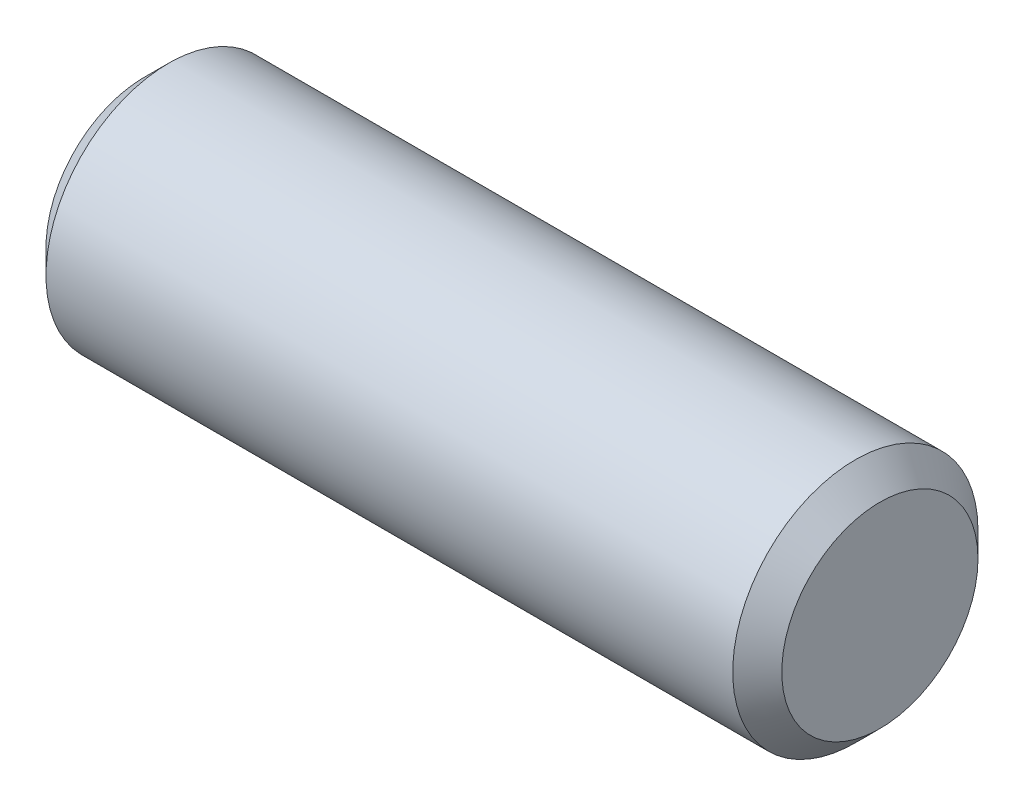
ISO-10303-21;
HEADER;
FILE_DESCRIPTION(('STEP AP214'),'2;1');
FILE_NAME('part.step','',(''),(''),'','','');
FILE_SCHEMA(('AUTOMOTIVE_DESIGN { 1 0 10303 214 1 1 1 1 }'));
ENDSEC;
DATA;
#1=APPLICATION_CONTEXT('core data for automotive mechanical design processes');
#2=APPLICATION_PROTOCOL_DEFINITION('international standard','automotive_design',2000,#1);
#3=PRODUCT_CONTEXT('',#1,'mechanical');
#4=PRODUCT('Part','Part','',(#3));
#5=PRODUCT_RELATED_PRODUCT_CATEGORY('part','',(#4));
#6=PRODUCT_DEFINITION_FORMATION('','',#4);
#7=PRODUCT_DEFINITION_CONTEXT('part definition',#1,'design');
#8=PRODUCT_DEFINITION('design','',#6,#7);
#9=PRODUCT_DEFINITION_SHAPE('','',#8);
#10=(LENGTH_UNIT() NAMED_UNIT(*) SI_UNIT(.MILLI.,.METRE.));
#11=(NAMED_UNIT(*) PLANE_ANGLE_UNIT() SI_UNIT($,.RADIAN.));
#12=(NAMED_UNIT(*) SI_UNIT($,.STERADIAN.) SOLID_ANGLE_UNIT());
#13=UNCERTAINTY_MEASURE_WITH_UNIT(LENGTH_MEASURE(1.E-05),#10,'distance_accuracy_value','');
#14=(GEOMETRIC_REPRESENTATION_CONTEXT(3) GLOBAL_UNCERTAINTY_ASSIGNED_CONTEXT((#13)) GLOBAL_UNIT_ASSIGNED_CONTEXT((#10,
#11,#12)) REPRESENTATION_CONTEXT('',''));
#15=CARTESIAN_POINT('',(0.,0.,0.));
#16=DIRECTION('',(0.,0.,1.));
#17=DIRECTION('',(1.,0.,0.));
#18=AXIS2_PLACEMENT_3D('',#15,#16,#17);
#19=CARTESIAN_POINT('',(-4.7625,0.,0.));
#20=DIRECTION('',(1.,0.,0.));
#21=DIRECTION('',(0.,0.,-1.));
#22=AXIS2_PLACEMENT_3D('',#19,#20,#21);
#23=CYLINDRICAL_SURFACE('',#22,1.5875);
#24=CARTESIAN_POINT('',(4.445,0.,0.));
#25=DIRECTION('',(1.,0.,0.));
#26=DIRECTION('',(0.,0.,-1.));
#27=AXIS2_PLACEMENT_3D('',#24,#25,#26);
#28=CIRCLE('',#27,1.5875);
#29=CARTESIAN_POINT('',(4.445,0.,-1.5875));
#30=VERTEX_POINT('',#29);
#31=EDGE_CURVE('E40',#30,#30,#28,.F.);
#32=CARTESIAN_POINT('',(-4.445,0.,0.));
#33=DIRECTION('',(1.,0.,0.));
#34=DIRECTION('',(0.,0.,-1.));
#35=AXIS2_PLACEMENT_3D('',#32,#33,#34);
#36=CIRCLE('',#35,1.5875);
#37=CARTESIAN_POINT('',(-4.445,0.,-1.5875));
#38=VERTEX_POINT('',#37);
#39=EDGE_CURVE('E44',#38,#38,#36,.T.);
#40=CARTESIAN_POINT('',(4.445,0.,-1.5875));
#41=CARTESIAN_POINT('',(4.35239583333334,0.,-1.5875));
#42=CARTESIAN_POINT('',(4.25979166666667,0.,-1.5875));
#43=CARTESIAN_POINT('',(4.07458333333333,0.,-1.5875));
#44=CARTESIAN_POINT('',(3.98197916666667,0.,-1.5875));
#45=CARTESIAN_POINT('',(3.79677083333334,0.,-1.5875));
#46=CARTESIAN_POINT('',(3.70416666666667,0.,-1.5875));
#47=CARTESIAN_POINT('',(3.51895833333334,0.,-1.5875));
#48=CARTESIAN_POINT('',(3.42635416666667,0.,-1.5875));
#49=CARTESIAN_POINT('',(3.24114583333334,0.,-1.5875));
#50=CARTESIAN_POINT('',(3.14854166666667,0.,-1.5875));
#51=CARTESIAN_POINT('',(2.96333333333334,0.,-1.5875));
#52=CARTESIAN_POINT('',(2.87072916666667,0.,-1.5875));
#53=CARTESIAN_POINT('',(2.68552083333334,0.,-1.5875));
#54=CARTESIAN_POINT('',(2.59291666666667,0.,-1.5875));
#55=CARTESIAN_POINT('',(2.40770833333334,0.,-1.5875));
#56=CARTESIAN_POINT('',(2.31510416666667,0.,-1.5875));
#57=CARTESIAN_POINT('',(2.12989583333334,0.,-1.5875));
#58=CARTESIAN_POINT('',(2.03729166666667,0.,-1.5875));
#59=CARTESIAN_POINT('',(1.85208333333334,0.,-1.5875));
#60=CARTESIAN_POINT('',(1.75947916666667,0.,-1.5875));
#61=CARTESIAN_POINT('',(1.57427083333334,0.,-1.5875));
#62=CARTESIAN_POINT('',(1.48166666666667,0.,-1.5875));
#63=CARTESIAN_POINT('',(1.29645833333334,0.,-1.5875));
#64=CARTESIAN_POINT('',(1.20385416666667,0.,-1.5875));
#65=CARTESIAN_POINT('',(1.01864583333334,0.,-1.5875));
#66=CARTESIAN_POINT('',(0.926041666666669,0.,-1.5875));
#67=CARTESIAN_POINT('',(0.740833333333336,0.,-1.5875));
#68=CARTESIAN_POINT('',(0.648229166666669,0.,-1.5875));
#69=CARTESIAN_POINT('',(0.463020833333336,0.,-1.5875));
#70=CARTESIAN_POINT('',(0.370416666666669,0.,-1.5875));
#71=CARTESIAN_POINT('',(0.185208333333336,0.,-1.5875));
#72=CARTESIAN_POINT('',(0.0926041666666694,0.,-1.5875));
#73=CARTESIAN_POINT('',(-0.0926041666666642,0.,-1.5875));
#74=CARTESIAN_POINT('',(-0.185208333333331,0.,-1.5875));
#75=CARTESIAN_POINT('',(-0.370416666666664,0.,-1.5875));
#76=CARTESIAN_POINT('',(-0.463020833333331,0.,-1.5875));
#77=CARTESIAN_POINT('',(-0.648229166666664,0.,-1.5875));
#78=CARTESIAN_POINT('',(-0.740833333333331,0.,-1.5875));
#79=CARTESIAN_POINT('',(-0.926041666666664,0.,-1.5875));
#80=CARTESIAN_POINT('',(-1.01864583333333,0.,-1.5875));
#81=CARTESIAN_POINT('',(-1.20385416666666,0.,-1.5875));
#82=CARTESIAN_POINT('',(-1.29645833333333,0.,-1.5875));
#83=CARTESIAN_POINT('',(-1.48166666666666,0.,-1.5875));
#84=CARTESIAN_POINT('',(-1.57427083333333,0.,-1.5875));
#85=CARTESIAN_POINT('',(-1.75947916666666,0.,-1.5875));
#86=CARTESIAN_POINT('',(-1.85208333333333,0.,-1.5875));
#87=CARTESIAN_POINT('',(-2.03729166666666,0.,-1.5875));
#88=CARTESIAN_POINT('',(-2.12989583333333,0.,-1.5875));
#89=CARTESIAN_POINT('',(-2.31510416666666,0.,-1.5875));
#90=CARTESIAN_POINT('',(-2.40770833333333,0.,-1.5875));
#91=CARTESIAN_POINT('',(-2.59291666666666,0.,-1.5875));
#92=CARTESIAN_POINT('',(-2.68552083333333,0.,-1.5875));
#93=CARTESIAN_POINT('',(-2.87072916666666,0.,-1.5875));
#94=CARTESIAN_POINT('',(-2.96333333333333,0.,-1.5875));
#95=CARTESIAN_POINT('',(-3.14854166666666,0.,-1.5875));
#96=CARTESIAN_POINT('',(-3.24114583333333,0.,-1.5875));
#97=CARTESIAN_POINT('',(-3.42635416666666,0.,-1.5875));
#98=CARTESIAN_POINT('',(-3.51895833333333,0.,-1.5875));
#99=CARTESIAN_POINT('',(-3.70416666666666,0.,-1.5875));
#100=CARTESIAN_POINT('',(-3.79677083333333,0.,-1.5875));
#101=CARTESIAN_POINT('',(-3.98197916666666,0.,-1.5875));
#102=CARTESIAN_POINT('',(-4.07458333333333,0.,-1.5875));
#103=CARTESIAN_POINT('',(-4.25979166666666,0.,-1.5875));
#104=CARTESIAN_POINT('',(-4.35239583333333,0.,-1.5875));
#105=CARTESIAN_POINT('',(-4.445,0.,-1.5875));
#106=B_SPLINE_CURVE_WITH_KNOTS('',3,(#40,#41,#42,#43,#44,#45,#46,#47,#48,#49,#50,#51,#52,#53,
#54,#55,#56,#57,#58,#59,#60,#61,#62,#63,#64,#65,#66,#67,#68,#69,#70,#71,#72,#73,#74,#75,#76,#77,
#78,#79,#80,#81,#82,#83,#84,#85,#86,#87,#88,#89,#90,#91,#92,#93,#94,#95,#96,#97,#98,#99,#100,
#101,#102,#103,#104,#105),.UNSPECIFIED.,.F.,.F.,(4,2,2,2,2,2,2,2,2,2,2,2,2,2,2,2,2,2,2,2,2,2,2,
2,2,2,2,2,2,2,2,2,4),(0.,0.2778125,0.555625000000001,0.833437499999999,1.11125,1.3890625,
1.666875,1.9446875,2.2225,2.5003125,2.778125,3.0559375,3.33375,3.6115625,3.889375,4.1671875,
4.445,4.7228125,5.000625,5.2784375,5.55625,5.8340625,6.111875,6.3896875,6.6675,6.9453125,
7.223125,7.5009375,7.77875,8.0565625,8.334375,8.6121875,8.89),.UNSPECIFIED.);
#107=EDGE_CURVE('BSEAM33',#30,#38,#106,.T.);
#108=ORIENTED_EDGE('',*,*,#31,.T.);
#109=ORIENTED_EDGE('',*,*,#39,.T.);
#110=ORIENTED_EDGE('',*,*,#107,.T.);
#111=ORIENTED_EDGE('',*,*,#107,.F.);
#112=EDGE_LOOP('',(#108,#110,#109,#111));
#113=FACE_BOUND('',#112,.T.);
#114=ADVANCED_FACE('F33',(#113),#23,.T.);
#115=CARTESIAN_POINT('',(-4.7625,0.,0.));
#116=DIRECTION('',(1.,0.,0.));
#117=DIRECTION('',(0.,0.,-1.));
#118=AXIS2_PLACEMENT_3D('',#115,#116,#117);
#119=PLANE('',#118);
#120=CARTESIAN_POINT('',(-4.7625,0.,0.));
#121=DIRECTION('',(1.,0.,0.));
#122=DIRECTION('',(0.,0.,-1.));
#123=AXIS2_PLACEMENT_3D('',#120,#121,#122);
#124=CIRCLE('',#123,1.27);
#125=CARTESIAN_POINT('',(-4.7625,0.,-1.27));
#126=VERTEX_POINT('',#125);
#127=EDGE_CURVE('E10',#126,#126,#124,.F.);
#128=ORIENTED_EDGE('',*,*,#127,.T.);
#129=EDGE_LOOP('',(#128));
#130=FACE_BOUND('',#129,.T.);
#131=ADVANCED_FACE('F64',(#130),#119,.F.);
#132=CARTESIAN_POINT('',(4.7625,0.,0.));
#133=DIRECTION('',(1.,0.,0.));
#134=DIRECTION('',(0.,0.,-1.));
#135=AXIS2_PLACEMENT_3D('',#132,#133,#134);
#136=PLANE('',#135);
#137=CARTESIAN_POINT('',(4.7625,0.,0.));
#138=DIRECTION('',(1.,0.,0.));
#139=DIRECTION('',(0.,0.,-1.));
#140=AXIS2_PLACEMENT_3D('',#137,#138,#139);
#141=CIRCLE('',#140,1.27);
#142=CARTESIAN_POINT('',(4.7625,0.,-1.27));
#143=VERTEX_POINT('',#142);
#144=EDGE_CURVE('E48',#143,#143,#141,.T.);
#145=ORIENTED_EDGE('',*,*,#144,.T.);
#146=EDGE_LOOP('',(#145));
#147=FACE_BOUND('',#146,.T.);
#148=ADVANCED_FACE('F54',(#147),#136,.T.);
#149=CARTESIAN_POINT('',(4.7625,0.,0.));
#150=DIRECTION('',(-1.,0.,0.));
#151=DIRECTION('',(0.,0.,1.));
#152=AXIS2_PLACEMENT_3D('',#149,#150,#151);
#153=CONICAL_SURFACE('',#152,1.27,0.78539816339745);
#154=ORIENTED_EDGE('',*,*,#31,.F.);
#155=EDGE_LOOP('',(#154));
#156=FACE_BOUND('',#155,.T.);
#157=ORIENTED_EDGE('',*,*,#144,.F.);
#158=EDGE_LOOP('',(#157));
#159=FACE_BOUND('',#158,.T.);
#160=ADVANCED_FACE('F56',(#156,#159),#153,.T.);
#161=CARTESIAN_POINT('',(-4.445,0.,0.));
#162=DIRECTION('',(1.,0.,0.));
#163=DIRECTION('',(0.,0.,-1.));
#164=AXIS2_PLACEMENT_3D('',#161,#162,#163);
#165=CONICAL_SURFACE('',#164,1.5875,0.785398163397448);
#166=ORIENTED_EDGE('',*,*,#127,.F.);
#167=EDGE_LOOP('',(#166));
#168=FACE_BOUND('',#167,.T.);
#169=ORIENTED_EDGE('',*,*,#39,.F.);
#170=EDGE_LOOP('',(#169));
#171=FACE_BOUND('',#170,.T.);
#172=ADVANCED_FACE('F35',(#168,#171),#165,.T.);
#173=CLOSED_SHELL('',(#114,#131,#148,#160,#172));
#174=MANIFOLD_SOLID_BREP('B2',#173);
#175=ADVANCED_BREP_SHAPE_REPRESENTATION('',(#18,#174),#14);
#176=SHAPE_DEFINITION_REPRESENTATION(#9,#175);
ENDSEC;
END-ISO-10303-21;
